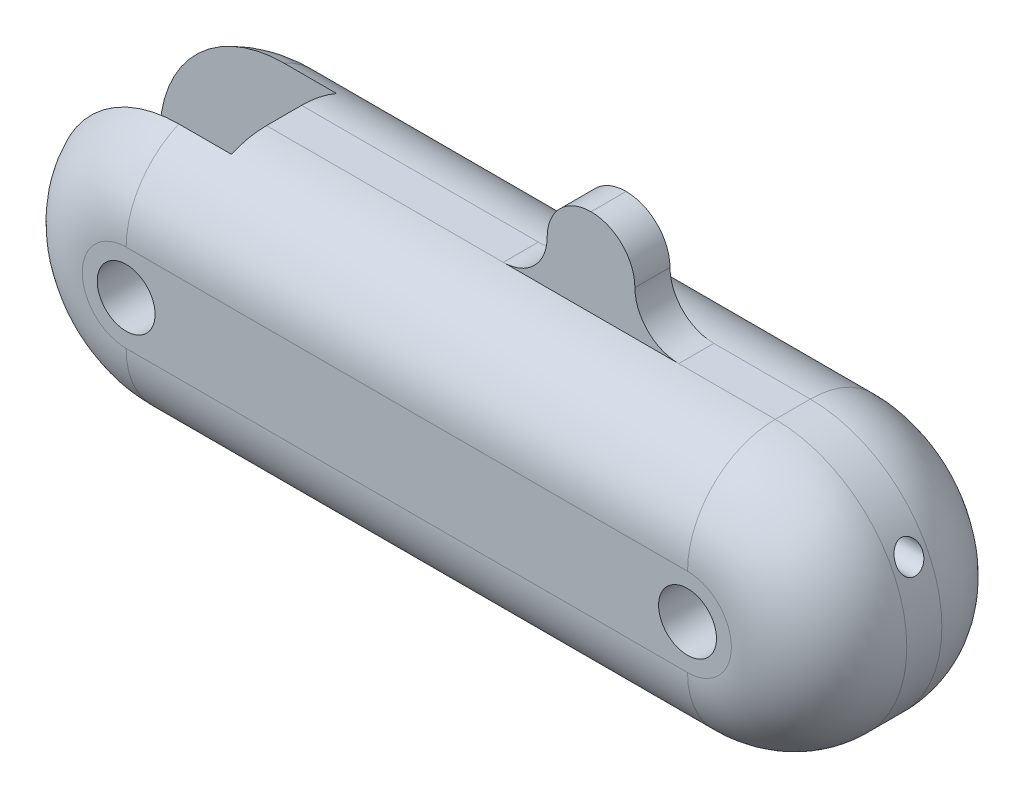
ISO-10303-21;
HEADER;
FILE_DESCRIPTION(('STEP AP214'),'2;1');
FILE_NAME('part.step','',(''),(''),'','','');
FILE_SCHEMA(('AUTOMOTIVE_DESIGN { 1 0 10303 214 1 1 1 1 }'));
ENDSEC;
DATA;
#1=APPLICATION_CONTEXT('core data for automotive mechanical design processes');
#2=APPLICATION_PROTOCOL_DEFINITION('international standard','automotive_design',2000,#1);
#3=PRODUCT_CONTEXT('',#1,'mechanical');
#4=PRODUCT('Part','Part','',(#3));
#5=PRODUCT_RELATED_PRODUCT_CATEGORY('part','',(#4));
#6=PRODUCT_DEFINITION_FORMATION('','',#4);
#7=PRODUCT_DEFINITION_CONTEXT('part definition',#1,'design');
#8=PRODUCT_DEFINITION('design','',#6,#7);
#9=PRODUCT_DEFINITION_SHAPE('','',#8);
#10=(LENGTH_UNIT() NAMED_UNIT(*) SI_UNIT(.MILLI.,.METRE.));
#11=(NAMED_UNIT(*) PLANE_ANGLE_UNIT() SI_UNIT($,.RADIAN.));
#12=(NAMED_UNIT(*) SI_UNIT($,.STERADIAN.) SOLID_ANGLE_UNIT());
#13=UNCERTAINTY_MEASURE_WITH_UNIT(LENGTH_MEASURE(1.E-05),#10,'distance_accuracy_value','');
#14=(GEOMETRIC_REPRESENTATION_CONTEXT(3) GLOBAL_UNCERTAINTY_ASSIGNED_CONTEXT((#13)) GLOBAL_UNIT_ASSIGNED_CONTEXT((#10,
#11,#12)) REPRESENTATION_CONTEXT('',''));
#15=CARTESIAN_POINT('',(0.,0.,0.));
#16=DIRECTION('',(0.,0.,1.));
#17=DIRECTION('',(1.,0.,0.));
#18=AXIS2_PLACEMENT_3D('',#15,#16,#17);
#19=CARTESIAN_POINT('',(-16.,0.,12.));
#20=DIRECTION('',(0.,-1.,0.));
#21=DIRECTION('',(1.,0.,0.));
#22=AXIS2_PLACEMENT_3D('',#19,#20,#21);
#23=PLANE('',#22);
#24=DIRECTION('',(-1.,0.,0.));
#25=VECTOR('',#24,1.);
#26=CARTESIAN_POINT('',(-16.,0.,7.));
#27=LINE('',#26,#25);
#28=CARTESIAN_POINT('',(-13.,0.,7.));
#29=VERTEX_POINT('',#28);
#30=CARTESIAN_POINT('',(0.5,0.,7.));
#31=VERTEX_POINT('',#30);
#32=EDGE_CURVE('E401',#29,#31,#27,.F.);
#33=ORIENTED_EDGE('',*,*,#32,.T.);
#34=DIRECTION('',(0.,0.,1.));
#35=VECTOR('',#34,1.);
#36=CARTESIAN_POINT('',(0.5,0.,5.));
#37=LINE('',#36,#35);
#38=CARTESIAN_POINT('',(0.5,0.,5.));
#39=VERTEX_POINT('',#38);
#40=EDGE_CURVE('E303',#31,#39,#37,.F.);
#41=ORIENTED_EDGE('',*,*,#40,.T.);
#42=DIRECTION('',(-1.,0.,0.));
#43=VECTOR('',#42,1.);
#44=CARTESIAN_POINT('',(-16.,0.,5.));
#45=LINE('',#44,#43);
#46=CARTESIAN_POINT('',(-13.,0.,5.));
#47=VERTEX_POINT('',#46);
#48=EDGE_CURVE('E403',#39,#47,#45,.T.);
#49=ORIENTED_EDGE('',*,*,#48,.T.);
#50=DIRECTION('',(0.,0.,1.));
#51=VECTOR('',#50,1.);
#52=CARTESIAN_POINT('',(-13.,0.,3.));
#53=LINE('',#52,#51);
#54=EDGE_CURVE('E335',#47,#29,#53,.T.);
#55=ORIENTED_EDGE('',*,*,#54,.T.);
#56=EDGE_LOOP('',(#33,#41,#49,#55));
#57=FACE_BOUND('',#56,.T.);
#58=ADVANCED_FACE('F33',(#57),#23,.F.);
#59=CARTESIAN_POINT('',(16.,0.,5.));
#60=VERTEX_POINT('',#59);
#61=CARTESIAN_POINT('',(10.5,0.,5.));
#62=VERTEX_POINT('',#61);
#63=EDGE_CURVE('E404',#60,#62,#45,.T.);
#64=ORIENTED_EDGE('',*,*,#63,.T.);
#65=DIRECTION('',(0.,0.,-1.));
#66=VECTOR('',#65,1.);
#67=CARTESIAN_POINT('',(10.5,0.,7.));
#68=LINE('',#67,#66);
#69=CARTESIAN_POINT('',(10.5,0.,7.));
#70=VERTEX_POINT('',#69);
#71=EDGE_CURVE('E310',#62,#70,#68,.F.);
#72=ORIENTED_EDGE('',*,*,#71,.T.);
#73=CARTESIAN_POINT('',(16.,0.,7.));
#74=VERTEX_POINT('',#73);
#75=EDGE_CURVE('E400',#70,#74,#27,.F.);
#76=ORIENTED_EDGE('',*,*,#75,.T.);
#77=DIRECTION('',(0.,0.,-1.));
#78=VECTOR('',#77,1.);
#79=CARTESIAN_POINT('',(16.,0.,12.));
#80=LINE('',#79,#78);
#81=EDGE_CURVE('E365',#74,#60,#80,.T.);
#82=ORIENTED_EDGE('',*,*,#81,.T.);
#83=EDGE_LOOP('',(#64,#72,#76,#82));
#84=FACE_BOUND('',#83,.T.);
#85=ADVANCED_FACE('F252',(#84),#23,.F.);
#86=CARTESIAN_POINT('',(16.,-7.5,12.));
#87=DIRECTION('',(0.,0.,-1.));
#88=DIRECTION('',(-1.,0.,0.));
#89=AXIS2_PLACEMENT_3D('',#86,#87,#88);
#90=CYLINDRICAL_SURFACE('',#89,7.50000000000001);
#91=CARTESIAN_POINT('',(22.6332495807108,-4.,5.25));
#92=CARTESIAN_POINT('',(22.6568652100945,-4.04475712896393,5.25000069696609));
#93=CARTESIAN_POINT('',(22.6800293767484,-4.08976492895581,5.25400927517588));
#94=CARTESIAN_POINT('',(22.7248658777341,-4.1790551435472,5.27027538348579));
#95=CARTESIAN_POINT('',(22.7465380552073,-4.22333748150426,5.28253377946583));
#96=CARTESIAN_POINT('',(22.7879116758938,-4.30992682615475,5.31545723063562));
#97=CARTESIAN_POINT('',(22.8076045419242,-4.35222484491178,5.336157060362));
#98=CARTESIAN_POINT('',(22.8443674457023,-4.43298144567067,5.38577757165474));
#99=CARTESIAN_POINT('',(22.8614387598698,-4.47144189295035,5.41469423281491));
#100=CARTESIAN_POINT('',(22.8911623275913,-4.53973742839442,5.47736494318931));
#101=CARTESIAN_POINT('',(22.9040660292328,-4.57002664644257,5.51050419857445));
#102=CARTESIAN_POINT('',(22.9269531189977,-4.62455266895225,5.58231320481981));
#103=CARTESIAN_POINT('',(22.9369382953721,-4.64879317826637,5.62097954737949));
#104=CARTESIAN_POINT('',(22.9529869063967,-4.68817040363519,5.69891372918083));
#105=CARTESIAN_POINT('',(22.9593235719089,-4.70393268754241,5.73781010676271));
#106=CARTESIAN_POINT('',(22.9692604124838,-4.72879255774519,5.81800707831997));
#107=CARTESIAN_POINT('',(22.9728616243726,-4.73789266917448,5.85930675496975));
#108=CARTESIAN_POINT('',(22.9771383733366,-4.74871452689673,5.94068250069714));
#109=CARTESIAN_POINT('',(22.977964010453,-4.75081476114192,5.98070082955286));
#110=CARTESIAN_POINT('',(22.9770983322195,-4.7486184483497,6.06053083904639));
#111=CARTESIAN_POINT('',(22.9754073999443,-4.74432287488856,6.10034255021011));
#112=CARTESIAN_POINT('',(22.9695866751644,-4.72963511410702,6.17795271899596));
#113=CARTESIAN_POINT('',(22.9654973975342,-4.71934422356824,6.21577350399642));
#114=CARTESIAN_POINT('',(22.9549825205337,-4.69314838459035,6.28906769075068));
#115=CARTESIAN_POINT('',(22.9485568521372,-4.67724327028505,6.32454102311475));
#116=CARTESIAN_POINT('',(22.9333388667533,-4.6400662297977,6.39288228153309));
#117=CARTESIAN_POINT('',(22.9245047094671,-4.61869988546117,6.42568939411336));
#118=CARTESIAN_POINT('',(22.9046866646446,-4.57152680231289,6.48719637753227));
#119=CARTESIAN_POINT('',(22.8937023940896,-4.54571927245275,6.51589551500178));
#120=CARTESIAN_POINT('',(22.8691641560276,-4.48908949081757,6.57000258230612));
#121=CARTESIAN_POINT('',(22.8555068553954,-4.45807722125553,6.5951643464781));
#122=CARTESIAN_POINT('',(22.8263026183871,-4.39309447378724,6.63994971569263));
#123=CARTESIAN_POINT('',(22.8107550987679,-4.35912308374078,6.65957160512373));
#124=CARTESIAN_POINT('',(22.7767476900571,-4.28636850281494,6.69444106370555));
#125=CARTESIAN_POINT('',(22.7581540750848,-4.24741815677613,6.709208755228));
#126=CARTESIAN_POINT('',(22.71950375169,-4.16830211749591,6.73203260387971));
#127=CARTESIAN_POINT('',(22.6994464555126,-4.12813593985683,6.74008604853172));
#128=CARTESIAN_POINT('',(22.6563085373537,-4.04369983150149,6.75004397376913));
#129=CARTESIAN_POINT('',(22.6331223675881,-3.99940542782166,6.75128539519353));
#130=CARTESIAN_POINT('',(22.5860588230827,-3.91164199428551,6.74607476207137));
#131=CARTESIAN_POINT('',(22.5621811684306,-3.86817331081142,6.73961954823108));
#132=CARTESIAN_POINT('',(22.5124790173255,-3.77973344935155,6.71847576043198));
#133=CARTESIAN_POINT('',(22.486647679833,-3.73490877068938,6.70318531284591));
#134=CARTESIAN_POINT('',(22.4357343535149,-3.64852752977387,6.66423898345623));
#135=CARTESIAN_POINT('',(22.4106529100033,-3.60697331155975,6.64057716719651));
#136=CARTESIAN_POINT('',(22.3621650327383,-3.52822396654696,6.58503138384834));
#137=CARTESIAN_POINT('',(22.3387675581801,-3.49105156771565,6.55310707545874));
#138=CARTESIAN_POINT('',(22.2951208610375,-3.42285769464486,6.48149765334739));
#139=CARTESIAN_POINT('',(22.2748655342586,-3.39182426121488,6.44182793409188));
#140=CARTESIAN_POINT('',(22.2441296604099,-3.34531674164023,6.36773463912217));
#141=CARTESIAN_POINT('',(22.2325031742713,-3.32792254459539,6.33498389337065));
#142=CARTESIAN_POINT('',(22.2123269530317,-3.29793850852277,6.26646615448601));
#143=CARTESIAN_POINT('',(22.2037747168345,-3.28534476351841,6.23070164261998));
#144=CARTESIAN_POINT('',(22.1902984185428,-3.26557533684953,6.15681284743057));
#145=CARTESIAN_POINT('',(22.1853946024228,-3.2584298837293,6.1186766501743));
#146=CARTESIAN_POINT('',(22.1797033076017,-3.25014186597953,6.04145384644772));
#147=CARTESIAN_POINT('',(22.1789142561407,-3.2489970077805,6.00236760884516));
#148=CARTESIAN_POINT('',(22.1813931710046,-3.25260309406563,5.92827495646399));
#149=CARTESIAN_POINT('',(22.1842899276402,-3.25681456761362,5.8932277732572));
#150=CARTESIAN_POINT('',(22.193308211172,-3.26998861428829,5.82447604328706));
#151=CARTESIAN_POINT('',(22.1994299026123,-3.27895142984032,5.79077156512622));
#152=CARTESIAN_POINT('',(22.2146133796125,-3.30133780469566,5.72505739919943));
#153=CARTESIAN_POINT('',(22.2237143408386,-3.31482086291967,5.69307729890249));
#154=CARTESIAN_POINT('',(22.2443359325697,-3.3456514298456,5.63189268510944));
#155=CARTESIAN_POINT('',(22.255857406406,-3.36300028555895,5.60268914415963));
#156=CARTESIAN_POINT('',(22.2823887723703,-3.40338626249218,5.54395537476474));
#157=CARTESIAN_POINT('',(22.2976550846796,-3.42686421313565,5.51484516788648));
#158=CARTESIAN_POINT('',(22.3299678350555,-3.47726403649822,5.46091603715502));
#159=CARTESIAN_POINT('',(22.3470153888876,-3.50418807023977,5.43609982921319));
#160=CARTESIAN_POINT('',(22.3852466837685,-3.56551988782083,5.38721317350811));
#161=CARTESIAN_POINT('',(22.4066486852218,-3.60042939812047,5.3639419420298));
#162=CARTESIAN_POINT('',(22.4503628456514,-3.67317076129835,5.32367729284259));
#163=CARTESIAN_POINT('',(22.4726753450833,-3.71100371213012,5.30668624776824));
#164=CARTESIAN_POINT('',(22.5182375061319,-3.78991735324902,5.27877439425189));
#165=CARTESIAN_POINT('',(22.5414956207365,-3.83106029081337,5.26804311416663));
#166=CARTESIAN_POINT('',(22.5877229967265,-3.91472586515507,5.25365538695503));
#167=CARTESIAN_POINT('',(22.6106922419369,-3.95724857871951,5.24999933426715));
#168=CARTESIAN_POINT('',(22.6332495807108,-4.,5.25));
#169=B_SPLINE_CURVE_WITH_KNOTS('',3,(#91,#92,#93,#94,#95,#96,#97,#98,#99,#100,#101,#102,#103,
#104,#105,#106,#107,#108,#109,#110,#111,#112,#113,#114,#115,#116,#117,#118,#119,#120,#121,#122,
#123,#124,#125,#126,#127,#128,#129,#130,#131,#132,#133,#134,#135,#136,#137,#138,#139,#140,#141,
#142,#143,#144,#145,#146,#147,#148,#149,#150,#151,#152,#153,#154,#155,#156,#157,#158,#159,#160,
#161,#162,#163,#164,#165,#166,#167,#168),.UNSPECIFIED.,.T.,.F.,(4,2,2,2,2,2,2,2,2,2,2,2,2,2,2,2,
2,2,2,2,2,2,2,2,2,2,2,2,2,2,2,2,2,2,2,2,2,2,4),(0.,0.151661005421156,0.303337931279042,
0.455646106620897,0.607879887173714,0.747256765609736,0.886548064567123,1.01322728571309,
1.1398584673014,1.25952084912074,1.37916501767401,1.49684401087809,1.61452648107235,
1.73440026024665,1.85429541305983,1.98037574012025,2.1064950695399,2.24277688192367,
2.37911372392491,2.52851299639748,2.6779736149916,2.83907034561562,3.00028150715966,
3.1622951331674,3.32398996653117,3.44011001590393,3.55613537933343,3.67279988942346,
3.78941980432111,3.89517224873057,4.00093008941374,4.10813854282546,4.21538441088787,
4.33610582335719,4.45690331400403,4.59763975196048,4.73842930548272,4.88328582896064,
5.02815042784517),.UNSPECIFIED.);
#170=CARTESIAN_POINT('',(22.6332495807108,-4.,5.25));
#171=VERTEX_POINT('',#170);
#172=EDGE_CURVE('E181',#171,#171,#169,.T.);
#173=ORIENTED_EDGE('',*,*,#172,.T.);
#174=EDGE_LOOP('',(#173));
#175=FACE_BOUND('',#174,.T.);
#176=DIRECTION('',(0.,0.,-1.));
#177=VECTOR('',#176,1.);
#178=CARTESIAN_POINT('',(16.,-15.,12.));
#179=LINE('',#178,#177);
#180=CARTESIAN_POINT('',(16.,-15.,7.));
#181=VERTEX_POINT('',#180);
#182=CARTESIAN_POINT('',(16.,-15.,5.));
#183=VERTEX_POINT('',#182);
#184=EDGE_CURVE('E362',#181,#183,#179,.T.);
#185=ORIENTED_EDGE('',*,*,#184,.T.);
#186=CARTESIAN_POINT('',(16.,-7.5,5.));
#187=DIRECTION('',(0.,0.,-1.));
#188=DIRECTION('',(-1.,0.,0.));
#189=AXIS2_PLACEMENT_3D('',#186,#187,#188);
#190=CIRCLE('',#189,7.50000000000001);
#191=EDGE_CURVE('E372',#183,#60,#190,.F.);
#192=ORIENTED_EDGE('',*,*,#191,.T.);
#193=ORIENTED_EDGE('',*,*,#81,.F.);
#194=CARTESIAN_POINT('',(16.,-7.5,7.));
#195=DIRECTION('',(0.,0.,-1.));
#196=DIRECTION('',(-1.,0.,0.));
#197=AXIS2_PLACEMENT_3D('',#194,#195,#196);
#198=CIRCLE('',#197,7.50000000000001);
#199=EDGE_CURVE('E369',#74,#181,#198,.T.);
#200=ORIENTED_EDGE('',*,*,#199,.T.);
#201=EDGE_LOOP('',(#185,#192,#193,#200));
#202=FACE_BOUND('',#201,.T.);
#203=ADVANCED_FACE('F257',(#175,#202),#90,.T.);
#204=CARTESIAN_POINT('',(-16.,-15.,12.));
#205=DIRECTION('',(0.,1.,0.));
#206=DIRECTION('',(-1.,0.,0.));
#207=AXIS2_PLACEMENT_3D('',#204,#205,#206);
#208=PLANE('',#207);
#209=DIRECTION('',(0.,0.,1.));
#210=VECTOR('',#209,1.);
#211=CARTESIAN_POINT('',(10.,-15.,12.));
#212=LINE('',#211,#210);
#213=CARTESIAN_POINT('',(10.,-15.,5.25));
#214=VERTEX_POINT('',#213);
#215=CARTESIAN_POINT('',(10.,-15.,6.75));
#216=VERTEX_POINT('',#215);
#217=EDGE_CURVE('E11',#214,#216,#212,.T.);
#218=ORIENTED_EDGE('',*,*,#217,.F.);
#219=CARTESIAN_POINT('',(10.,-15.,5.25));
#220=CARTESIAN_POINT('',(9.8786553115528,-15.0000000000001,5.25000690439239));
#221=CARTESIAN_POINT('',(9.7573099278768,-15.,5.250891047548));
#222=CARTESIAN_POINT('',(9.51464002609246,-15.,5.25446249443581));
#223=CARTESIAN_POINT('',(9.39331550925674,-14.9999999999999,5.25714988424491));
#224=CARTESIAN_POINT('',(9.15072021487093,-15.0000000000001,5.26437654510316));
#225=CARTESIAN_POINT('',(9.02944943775978,-15.0000000000003,5.26891583100906));
#226=CARTESIAN_POINT('',(8.7869985606308,-14.9999999999997,5.27994967343772));
#227=CARTESIAN_POINT('',(8.66581845887886,-14.999999999999,5.2864441915576));
#228=CARTESIAN_POINT('',(8.42357835076428,-14.999999999999,5.30154667188666));
#229=CARTESIAN_POINT('',(8.30251835576131,-14.9999999999997,5.31015481782885));
#230=CARTESIAN_POINT('',(8.06058890785677,-15.0000000000003,5.32972024380476));
#231=CARTESIAN_POINT('',(7.93971945096956,-15.0000000000001,5.34067747402587));
#232=CARTESIAN_POINT('',(7.6982207222834,-14.9999999999999,5.36529893233107));
#233=CARTESIAN_POINT('',(7.57759152436799,-15.,5.37896389247002));
#234=CARTESIAN_POINT('',(7.33675197460111,-15.,5.40953828680783));
#235=CARTESIAN_POINT('',(7.21654157313851,-15.,5.42644732241352));
#236=CARTESIAN_POINT('',(7.00146325352219,-15.,5.46050536397854));
#237=CARTESIAN_POINT('',(6.90647524844132,-15.,5.47688761783767));
#238=CARTESIAN_POINT('',(6.71710121712892,-15.,5.51304063760114));
#239=CARTESIAN_POINT('',(6.62271541284863,-15.0000000000001,5.53281258557124));
#240=CARTESIAN_POINT('',(6.44730199727983,-15.,5.57417603428693));
#241=CARTESIAN_POINT('',(6.36614305064421,-14.9999999999999,5.59519058592666));
#242=CARTESIAN_POINT('',(6.24558282318529,-15.0000000000001,5.63074022663307));
#243=CARTESIAN_POINT('',(6.20559275732403,-15.0000000000002,5.64326129427213));
#244=CARTESIAN_POINT('',(6.12622251344239,-14.9999999999998,5.67006693352249));
#245=CARTESIAN_POINT('',(6.08684207960103,-14.9999999999992,5.68435074154142));
#246=CARTESIAN_POINT('',(6.00889388978743,-14.9999999999992,5.71537872090576));
#247=CARTESIAN_POINT('',(5.97032879303098,-14.9999999999997,5.73212984146628));
#248=CARTESIAN_POINT('',(5.91381385421703,-15.0000000000002,5.76003173980566));
#249=CARTESIAN_POINT('',(5.89518708672045,-15.0000000000003,5.76980147903886));
#250=CARTESIAN_POINT('',(5.85862054052747,-14.9999999999997,5.79054110812943));
#251=CARTESIAN_POINT('',(5.84068028058815,-14.999999999999,5.80151013567805));
#252=CARTESIAN_POINT('',(5.80572364230906,-14.999999999999,5.82516138606118));
#253=CARTESIAN_POINT('',(5.7887160580541,-14.9999999999998,5.83785693458191));
#254=CARTESIAN_POINT('',(5.75668423800148,-15.0000000000002,5.86545088792904));
#255=CARTESIAN_POINT('',(5.74164907203042,-14.9999999999999,5.88033609057445));
#256=CARTESIAN_POINT('',(5.71713471374322,-14.9999999999998,5.91107943078985));
#257=CARTESIAN_POINT('',(5.7071741931091,-15.,5.92651642502982));
#258=CARTESIAN_POINT('',(5.69620980665463,-15.,5.95161194383834));
#259=CARTESIAN_POINT('',(5.69321034268142,-15.,5.96037681795978));
#260=CARTESIAN_POINT('',(5.68899511081927,-15.,5.97832228811796));
#261=CARTESIAN_POINT('',(5.68777498882952,-15.,5.98750181249339));
#262=CARTESIAN_POINT('',(5.68733704480131,-15.,6.00477258037728));
#263=CARTESIAN_POINT('',(5.68789102202117,-15.,6.01285854575509));
#264=CARTESIAN_POINT('',(5.69043642320495,-15.,6.0288034760167));
#265=CARTESIAN_POINT('',(5.69242958991749,-15.,6.03666215366162));
#266=CARTESIAN_POINT('',(5.70155511505826,-15.,6.06347104019545));
#267=CARTESIAN_POINT('',(5.71190682126472,-15.,6.08130568452829));
#268=CARTESIAN_POINT('',(5.73500478329441,-15.,6.11199334886427));
#269=CARTESIAN_POINT('',(5.74736858443041,-15.,6.12517710821214));
#270=CARTESIAN_POINT('',(5.77379212369221,-15.,6.14979852584465));
#271=CARTESIAN_POINT('',(5.78785767324653,-15.,6.16122988030437));
#272=CARTESIAN_POINT('',(5.82564461741108,-15.0000000000001,6.18914411903249));
#273=CARTESIAN_POINT('',(5.85012249214401,-15.0000000000003,6.20457458874058));
#274=CARTESIAN_POINT('',(5.90037226714866,-14.9999999999997,6.23319904428693));
#275=CARTESIAN_POINT('',(5.92614694758817,-14.9999999999989,6.24638793446797));
#276=CARTESIAN_POINT('',(5.97854573968428,-15.0000000000011,6.27117870211012));
#277=CARTESIAN_POINT('',(6.00517240224077,-15.0000000000041,6.28277512852481));
#278=CARTESIAN_POINT('',(6.05893079478433,-14.9999999999959,6.30473615961403));
#279=CARTESIAN_POINT('',(6.08606267389185,-14.9999999999847,6.31510039370694));
#280=CARTESIAN_POINT('',(6.14455040902431,-14.9999999999828,6.33625754556623));
#281=CARTESIAN_POINT('',(6.17595940836225,-14.9999999999953,6.34690265970325));
#282=CARTESIAN_POINT('',(6.23910705570479,-15.0000000000047,6.36718794454289));
#283=CARTESIAN_POINT('',(6.27084579908401,-15.0000000000016,6.37682781505946));
#284=CARTESIAN_POINT('',(6.36618816425292,-14.9999999999967,6.40445082314261));
#285=CARTESIAN_POINT('',(6.43014441330145,-14.9999999999991,6.42121578269355));
#286=CARTESIAN_POINT('',(6.55864342010346,-15.0000000000009,6.45240136595964));
#287=CARTESIAN_POINT('',(6.62318643844035,-15.0000000000002,6.46682088838189));
#288=CARTESIAN_POINT('',(6.7526622638638,-14.9999999999998,6.49382232045113));
#289=CARTESIAN_POINT('',(6.81759512576085,-14.9999999999999,6.50640396508723));
#290=CARTESIAN_POINT('',(7.01297711551439,-15.0000000000002,6.54196041585399));
#291=CARTESIAN_POINT('',(7.14383100263404,-15.,6.56270575231078));
#292=CARTESIAN_POINT('',(7.40589118000774,-15.,6.59984925588892));
#293=CARTESIAN_POINT('',(7.53709640241337,-15.,6.61625523018717));
#294=CARTESIAN_POINT('',(7.79981759677297,-15.,6.64561848044803));
#295=CARTESIAN_POINT('',(7.9313333650194,-15.,6.65857759602564));
#296=CARTESIAN_POINT('',(8.1946094651167,-15.,6.68159485059648));
#297=CARTESIAN_POINT('',(8.32636978658885,-15.,6.69165310999021));
#298=CARTESIAN_POINT('',(8.59007585392896,-15.,6.70920881756569));
#299=CARTESIAN_POINT('',(8.72202162195315,-15.,6.71670592795358));
#300=CARTESIAN_POINT('',(9.04481618190237,-15.,6.73218255788444));
#301=CARTESIAN_POINT('',(9.23572719646818,-15.,6.73888990749663));
#302=CARTESIAN_POINT('',(9.52222208680566,-15.,6.74557060760416));
#303=CARTESIAN_POINT('',(9.61777083412083,-15.,6.74723411152844));
#304=CARTESIAN_POINT('',(9.80887932228001,-15.,6.74944799045482));
#305=CARTESIAN_POINT('',(9.90443906286278,-15.,6.74999838795598));
#306=CARTESIAN_POINT('',(9.99999999999999,-15.,6.75));
#307=B_SPLINE_CURVE_WITH_KNOTS('',3,(#219,#220,#221,#222,#223,#224,#225,#226,#227,#228,#229,
#230,#231,#232,#233,#234,#235,#236,#237,#238,#239,#240,#241,#242,#243,#244,#245,#246,#247,#248,
#249,#250,#251,#252,#253,#254,#255,#256,#257,#258,#259,#260,#261,#262,#263,#264,#265,#266,#267,
#268,#269,#270,#271,#272,#273,#274,#275,#276,#277,#278,#279,#280,#281,#282,#283,#284,#285,#286,
#287,#288,#289,#290,#291,#292,#293,#294,#295,#296,#297,#298,#299,#300,#301,#302,#303,#304,#305,
#306),.UNSPECIFIED.,.F.,.F.,(4,2,2,2,2,2,2,2,2,2,2,2,2,2,2,2,2,2,2,2,2,2,2,2,2,2,2,2,2,2,2,2,2,
2,2,2,2,2,2,2,2,2,2,4),(0.,0.364031968082436,0.728081314249738,1.09213358104363,
1.45617869792269,1.82025547165356,2.18432452585767,2.54849214345588,2.91261504511522,
3.20174043444684,3.49096685443027,3.74233431842156,3.86801606503461,3.99364355808143,
4.11963189924161,4.18270036984509,4.24572378771076,4.30926461593009,4.37243694692401,
4.42684925262164,4.45449118406235,4.48206536074311,4.50624180427977,4.53044757284627,
4.59109885006721,4.64515923221705,4.69940973631592,4.78600951823951,4.87280360328479,
4.95988775124416,5.04699802384502,5.14646729098387,5.24596617710415,5.44424587499086,
5.64261840741442,5.8410195157845,6.23837099262914,6.63500263414805,7.03142216360787,
7.42782523724423,7.82428057292375,8.39730108679521,8.68398563760007,8.97066439363672),.UNSPECIFIED.);
#308=EDGE_CURVE('E173',#214,#216,#307,.T.);
#309=ORIENTED_EDGE('',*,*,#308,.T.);
#310=EDGE_LOOP('',(#218,#309));
#311=FACE_BOUND('',#310,.T.);
#312=DIRECTION('',(1.,0.,0.));
#313=VECTOR('',#312,1.);
#314=CARTESIAN_POINT('',(-16.,-15.,7.));
#315=LINE('',#314,#313);
#316=CARTESIAN_POINT('',(-13.,-15.,7.));
#317=VERTEX_POINT('',#316);
#318=EDGE_CURVE('E385',#181,#317,#315,.F.);
#319=ORIENTED_EDGE('',*,*,#318,.T.);
#320=DIRECTION('',(0.,0.,-1.));
#321=VECTOR('',#320,1.);
#322=CARTESIAN_POINT('',(-13.,-15.,12.));
#323=LINE('',#322,#321);
#324=CARTESIAN_POINT('',(-13.,-15.,5.));
#325=VERTEX_POINT('',#324);
#326=EDGE_CURVE('E350',#317,#325,#323,.T.);
#327=ORIENTED_EDGE('',*,*,#326,.T.);
#328=DIRECTION('',(1.,0.,0.));
#329=VECTOR('',#328,1.);
#330=CARTESIAN_POINT('',(16.,-15.,5.));
#331=LINE('',#330,#329);
#332=EDGE_CURVE('E388',#325,#183,#331,.T.);
#333=ORIENTED_EDGE('',*,*,#332,.T.);
#334=ORIENTED_EDGE('',*,*,#184,.F.);
#335=EDGE_LOOP('',(#319,#327,#333,#334));
#336=FACE_BOUND('',#335,.T.);
#337=ADVANCED_FACE('F176',(#311,#336),#208,.F.);
#338=CARTESIAN_POINT('',(16.,-7.5,12.));
#339=DIRECTION('',(0.,0.,-1.));
#340=DIRECTION('',(-1.,0.,0.));
#341=AXIS2_PLACEMENT_3D('',#338,#339,#340);
#342=PLANE('',#341);
#343=CARTESIAN_POINT('',(16.,-7.50000000000001,12.));
#344=DIRECTION('',(0.,0.,1.));
#345=DIRECTION('',(1.,0.,0.));
#346=AXIS2_PLACEMENT_3D('',#343,#344,#345);
#347=CIRCLE('',#346,1.65);
#348=CARTESIAN_POINT('',(17.65,-7.50000000000001,12.));
#349=VERTEX_POINT('',#348);
#350=EDGE_CURVE('E331',#349,#349,#347,.T.);
#351=ORIENTED_EDGE('',*,*,#350,.F.);
#352=EDGE_LOOP('',(#351));
#353=FACE_BOUND('',#352,.T.);
#354=CARTESIAN_POINT('',(-16.,-7.50000000000001,12.));
#355=DIRECTION('',(0.,0.,1.));
#356=DIRECTION('',(1.,0.,0.));
#357=AXIS2_PLACEMENT_3D('',#354,#355,#356);
#358=CIRCLE('',#357,1.65);
#359=CARTESIAN_POINT('',(-14.35,-7.50000000000001,12.));
#360=VERTEX_POINT('',#359);
#361=EDGE_CURVE('E324',#360,#360,#358,.T.);
#362=ORIENTED_EDGE('',*,*,#361,.F.);
#363=EDGE_LOOP('',(#362));
#364=FACE_BOUND('',#363,.T.);
#365=DIRECTION('',(1.,0.,0.));
#366=VECTOR('',#365,1.);
#367=CARTESIAN_POINT('',(16.,-10.,12.));
#368=LINE('',#367,#366);
#369=CARTESIAN_POINT('',(-16.,-10.,12.));
#370=VERTEX_POINT('',#369);
#371=CARTESIAN_POINT('',(16.,-10.,12.));
#372=VERTEX_POINT('',#371);
#373=EDGE_CURVE('E395',#370,#372,#368,.T.);
#374=ORIENTED_EDGE('',*,*,#373,.T.);
#375=CARTESIAN_POINT('',(16.,-7.5,12.));
#376=DIRECTION('',(0.,0.,-1.));
#377=DIRECTION('',(-1.,0.,0.));
#378=AXIS2_PLACEMENT_3D('',#375,#376,#377);
#379=CIRCLE('',#378,2.5);
#380=CARTESIAN_POINT('',(16.,-4.99999999999999,12.));
#381=VERTEX_POINT('',#380);
#382=EDGE_CURVE('E397',#372,#381,#379,.F.);
#383=ORIENTED_EDGE('',*,*,#382,.T.);
#384=DIRECTION('',(-1.,0.,0.));
#385=VECTOR('',#384,1.);
#386=CARTESIAN_POINT('',(16.,-4.99999999999999,12.));
#387=LINE('',#386,#385);
#388=CARTESIAN_POINT('',(-16.,-5.,12.));
#389=VERTEX_POINT('',#388);
#390=EDGE_CURVE('E390',#381,#389,#387,.T.);
#391=ORIENTED_EDGE('',*,*,#390,.T.);
#392=CARTESIAN_POINT('',(-16.,-7.5,12.));
#393=DIRECTION('',(0.,0.,-1.));
#394=DIRECTION('',(-1.,0.,0.));
#395=AXIS2_PLACEMENT_3D('',#392,#393,#394);
#396=CIRCLE('',#395,2.5);
#397=EDGE_CURVE('E393',#389,#370,#396,.F.);
#398=ORIENTED_EDGE('',*,*,#397,.T.);
#399=EDGE_LOOP('',(#374,#383,#391,#398));
#400=FACE_BOUND('',#399,.T.);
#401=ADVANCED_FACE('F236',(#353,#364,#400),#342,.F.);
#402=CARTESIAN_POINT('',(16.,-7.5,0.));
#403=DIRECTION('',(0.,0.,-1.));
#404=DIRECTION('',(-1.,0.,0.));
#405=AXIS2_PLACEMENT_3D('',#402,#403,#404);
#406=PLANE('',#405);
#407=CARTESIAN_POINT('',(16.,-7.50000000000001,0.));
#408=DIRECTION('',(0.,0.,1.));
#409=DIRECTION('',(1.,0.,0.));
#410=AXIS2_PLACEMENT_3D('',#407,#408,#409);
#411=CIRCLE('',#410,1.65);
#412=CARTESIAN_POINT('',(17.65,-7.50000000000001,0.));
#413=VERTEX_POINT('',#412);
#414=EDGE_CURVE('E328',#413,#413,#411,.T.);
#415=ORIENTED_EDGE('',*,*,#414,.T.);
#416=EDGE_LOOP('',(#415));
#417=FACE_BOUND('',#416,.T.);
#418=CARTESIAN_POINT('',(-16.,-7.50000000000001,0.));
#419=DIRECTION('',(0.,0.,1.));
#420=DIRECTION('',(1.,0.,0.));
#421=AXIS2_PLACEMENT_3D('',#418,#419,#420);
#422=CIRCLE('',#421,1.65);
#423=CARTESIAN_POINT('',(-14.35,-7.50000000000001,0.));
#424=VERTEX_POINT('',#423);
#425=EDGE_CURVE('E318',#424,#424,#422,.T.);
#426=ORIENTED_EDGE('',*,*,#425,.T.);
#427=EDGE_LOOP('',(#426));
#428=FACE_BOUND('',#427,.T.);
#429=DIRECTION('',(-1.,0.,0.));
#430=VECTOR('',#429,1.);
#431=CARTESIAN_POINT('',(16.,-4.99999999999999,0.));
#432=LINE('',#431,#430);
#433=CARTESIAN_POINT('',(-16.,-5.,0.));
#434=VERTEX_POINT('',#433);
#435=CARTESIAN_POINT('',(16.,-4.99999999999999,0.));
#436=VERTEX_POINT('',#435);
#437=EDGE_CURVE('E375',#434,#436,#432,.F.);
#438=ORIENTED_EDGE('',*,*,#437,.T.);
#439=CARTESIAN_POINT('',(16.,-7.5,0.));
#440=DIRECTION('',(0.,0.,-1.));
#441=DIRECTION('',(-1.,0.,0.));
#442=AXIS2_PLACEMENT_3D('',#439,#440,#441);
#443=CIRCLE('',#442,2.5);
#444=CARTESIAN_POINT('',(16.,-10.,0.));
#445=VERTEX_POINT('',#444);
#446=EDGE_CURVE('E382',#436,#445,#443,.T.);
#447=ORIENTED_EDGE('',*,*,#446,.T.);
#448=DIRECTION('',(1.,0.,0.));
#449=VECTOR('',#448,1.);
#450=CARTESIAN_POINT('',(-16.,-10.,0.));
#451=LINE('',#450,#449);
#452=CARTESIAN_POINT('',(-16.,-10.,0.));
#453=VERTEX_POINT('',#452);
#454=EDGE_CURVE('E379',#445,#453,#451,.F.);
#455=ORIENTED_EDGE('',*,*,#454,.T.);
#456=CARTESIAN_POINT('',(-16.,-7.5,0.));
#457=DIRECTION('',(0.,0.,-1.));
#458=DIRECTION('',(-1.,0.,0.));
#459=AXIS2_PLACEMENT_3D('',#456,#457,#458);
#460=CIRCLE('',#459,2.5);
#461=EDGE_CURVE('E377',#453,#434,#460,.T.);
#462=ORIENTED_EDGE('',*,*,#461,.T.);
#463=EDGE_LOOP('',(#438,#447,#455,#462));
#464=FACE_BOUND('',#463,.T.);
#465=ADVANCED_FACE('F238',(#417,#428,#464),#406,.T.);
#466=CARTESIAN_POINT('',(-16.,-7.5,5.));
#467=DIRECTION('',(0.,0.,-1.));
#468=DIRECTION('',(-1.,0.,0.));
#469=AXIS2_PLACEMENT_3D('',#466,#467,#468);
#470=DEGENERATE_TOROIDAL_SURFACE('',#469,2.5,5.,.T.);
#471=CARTESIAN_POINT('',(-16.,-7.5,3.));
#472=DIRECTION('',(0.,0.,-1.));
#473=DIRECTION('',(-1.,0.,0.));
#474=AXIS2_PLACEMENT_3D('',#471,#472,#473);
#475=CIRCLE('',#474,7.08257569495584);
#476=CARTESIAN_POINT('',(-16.,-0.417424305044161,3.));
#477=VERTEX_POINT('',#476);
#478=CARTESIAN_POINT('',(-16.,-14.5825756949558,3.));
#479=VERTEX_POINT('',#478);
#480=EDGE_CURVE('E357',#477,#479,#475,.F.);
#481=ORIENTED_EDGE('',*,*,#480,.F.);
#482=CARTESIAN_POINT('',(-16.,-5.,5.));
#483=DIRECTION('',(1.,0.,0.));
#484=DIRECTION('',(0.,1.,0.));
#485=AXIS2_PLACEMENT_3D('',#482,#483,#484);
#486=CIRCLE('',#485,5.);
#487=EDGE_CURVE('E412',#434,#477,#486,.T.);
#488=ORIENTED_EDGE('',*,*,#487,.F.);
#489=ORIENTED_EDGE('',*,*,#461,.F.);
#490=CARTESIAN_POINT('',(-16.,-10.,5.));
#491=DIRECTION('',(1.,0.,0.));
#492=DIRECTION('',(0.,0.,-1.));
#493=AXIS2_PLACEMENT_3D('',#490,#491,#492);
#494=CIRCLE('',#493,5.);
#495=EDGE_CURVE('E366',#479,#453,#494,.T.);
#496=ORIENTED_EDGE('',*,*,#495,.F.);
#497=EDGE_LOOP('',(#481,#488,#489,#496));
#498=FACE_BOUND('',#497,.T.);
#499=ADVANCED_FACE('F241',(#498),#470,.T.);
#500=CARTESIAN_POINT('',(-16.,-10.,5.));
#501=DIRECTION('',(-1.,0.,0.));
#502=DIRECTION('',(0.,-1.,0.));
#503=AXIS2_PLACEMENT_3D('',#500,#501,#502);
#504=CYLINDRICAL_SURFACE('',#503,5.);
#505=CARTESIAN_POINT('',(-13.,-10.,5.));
#506=DIRECTION('',(1.,0.,0.));
#507=DIRECTION('',(0.,0.,-1.));
#508=AXIS2_PLACEMENT_3D('',#505,#506,#507);
#509=CIRCLE('',#508,5.);
#510=CARTESIAN_POINT('',(-13.,-14.5825756949558,3.));
#511=VERTEX_POINT('',#510);
#512=EDGE_CURVE('E353',#511,#325,#509,.F.);
#513=ORIENTED_EDGE('',*,*,#512,.F.);
#514=DIRECTION('',(-1.,0.,0.));
#515=VECTOR('',#514,1.);
#516=CARTESIAN_POINT('',(-16.,-14.5825756949558,3.));
#517=LINE('',#516,#515);
#518=EDGE_CURVE('E359',#479,#511,#517,.F.);
#519=ORIENTED_EDGE('',*,*,#518,.F.);
#520=ORIENTED_EDGE('',*,*,#495,.T.);
#521=ORIENTED_EDGE('',*,*,#454,.F.);
#522=CARTESIAN_POINT('',(16.,-10.,5.));
#523=DIRECTION('',(1.,0.,0.));
#524=DIRECTION('',(0.,0.,-1.));
#525=AXIS2_PLACEMENT_3D('',#522,#523,#524);
#526=CIRCLE('',#525,5.);
#527=EDGE_CURVE('E409',#183,#445,#526,.T.);
#528=ORIENTED_EDGE('',*,*,#527,.F.);
#529=ORIENTED_EDGE('',*,*,#332,.F.);
#530=EDGE_LOOP('',(#513,#519,#520,#521,#528,#529));
#531=FACE_BOUND('',#530,.T.);
#532=ADVANCED_FACE('F246',(#531),#504,.T.);
#533=CARTESIAN_POINT('',(-16.,-5.,5.));
#534=DIRECTION('',(1.,0.,0.));
#535=DIRECTION('',(0.,1.,0.));
#536=AXIS2_PLACEMENT_3D('',#533,#534,#535);
#537=CYLINDRICAL_SURFACE('',#536,5.);
#538=CARTESIAN_POINT('',(-13.,-5.,5.));
#539=DIRECTION('',(1.,0.,0.));
#540=DIRECTION('',(0.,0.,-1.));
#541=AXIS2_PLACEMENT_3D('',#538,#539,#540);
#542=CIRCLE('',#541,5.);
#543=CARTESIAN_POINT('',(-13.,-0.41742430504416,3.));
#544=VERTEX_POINT('',#543);
#545=EDGE_CURVE('E355',#47,#544,#542,.F.);
#546=ORIENTED_EDGE('',*,*,#545,.F.);
#547=ORIENTED_EDGE('',*,*,#48,.F.);
#548=DIRECTION('',(-1.,0.,0.));
#549=VECTOR('',#548,1.);
#550=CARTESIAN_POINT('',(3.,0.,5.));
#551=LINE('',#550,#549);
#552=EDGE_CURVE('E55',#62,#39,#551,.T.);
#553=ORIENTED_EDGE('',*,*,#552,.F.);
#554=ORIENTED_EDGE('',*,*,#63,.F.);
#555=CARTESIAN_POINT('',(16.,-4.99999999999999,5.));
#556=DIRECTION('',(1.,0.,0.));
#557=DIRECTION('',(0.,0.,-1.));
#558=AXIS2_PLACEMENT_3D('',#555,#556,#557);
#559=CIRCLE('',#558,5.);
#560=EDGE_CURVE('E407',#436,#60,#559,.T.);
#561=ORIENTED_EDGE('',*,*,#560,.F.);
#562=ORIENTED_EDGE('',*,*,#437,.F.);
#563=ORIENTED_EDGE('',*,*,#487,.T.);
#564=DIRECTION('',(1.,0.,0.));
#565=VECTOR('',#564,1.);
#566=CARTESIAN_POINT('',(-16.,-0.417424305044161,3.));
#567=LINE('',#566,#565);
#568=EDGE_CURVE('E426',#544,#477,#567,.F.);
#569=ORIENTED_EDGE('',*,*,#568,.F.);
#570=EDGE_LOOP('',(#546,#547,#553,#554,#561,#562,#563,#569));
#571=FACE_BOUND('',#570,.T.);
#572=ADVANCED_FACE('F268',(#571),#537,.T.);
#573=CARTESIAN_POINT('',(16.,-7.5,5.));
#574=DIRECTION('',(0.,0.,-1.));
#575=DIRECTION('',(-1.,0.,0.));
#576=AXIS2_PLACEMENT_3D('',#573,#574,#575);
#577=DEGENERATE_TOROIDAL_SURFACE('',#576,2.5,5.,.T.);
#578=ORIENTED_EDGE('',*,*,#527,.T.);
#579=ORIENTED_EDGE('',*,*,#446,.F.);
#580=ORIENTED_EDGE('',*,*,#560,.T.);
#581=ORIENTED_EDGE('',*,*,#191,.F.);
#582=EDGE_LOOP('',(#578,#579,#580,#581));
#583=FACE_BOUND('',#582,.T.);
#584=ADVANCED_FACE('F264',(#583),#577,.T.);
#585=CARTESIAN_POINT('',(-16.,-7.5,7.));
#586=DIRECTION('',(0.,0.,-1.));
#587=DIRECTION('',(-1.,0.,0.));
#588=AXIS2_PLACEMENT_3D('',#585,#586,#587);
#589=DEGENERATE_TOROIDAL_SURFACE('',#588,2.5,5.,.T.);
#590=CARTESIAN_POINT('',(-16.,-7.5,9.));
#591=DIRECTION('',(0.,0.,1.));
#592=DIRECTION('',(1.,0.,0.));
#593=AXIS2_PLACEMENT_3D('',#590,#591,#592);
#594=CIRCLE('',#593,7.08257569495584);
#595=CARTESIAN_POINT('',(-16.,-14.5825756949558,9.));
#596=VERTEX_POINT('',#595);
#597=CARTESIAN_POINT('',(-16.,-0.417424305044161,9.));
#598=VERTEX_POINT('',#597);
#599=EDGE_CURVE('E342',#596,#598,#594,.F.);
#600=ORIENTED_EDGE('',*,*,#599,.F.);
#601=CARTESIAN_POINT('',(-16.,-10.,7.));
#602=DIRECTION('',(1.,0.,0.));
#603=DIRECTION('',(0.,0.,-1.));
#604=AXIS2_PLACEMENT_3D('',#601,#602,#603);
#605=CIRCLE('',#604,5.);
#606=EDGE_CURVE('E410',#370,#596,#605,.T.);
#607=ORIENTED_EDGE('',*,*,#606,.F.);
#608=ORIENTED_EDGE('',*,*,#397,.F.);
#609=CARTESIAN_POINT('',(-16.,-5.,7.));
#610=DIRECTION('',(1.,0.,0.));
#611=DIRECTION('',(0.,1.,0.));
#612=AXIS2_PLACEMENT_3D('',#609,#610,#611);
#613=CIRCLE('',#612,5.);
#614=EDGE_CURVE('E419',#598,#389,#613,.T.);
#615=ORIENTED_EDGE('',*,*,#614,.F.);
#616=EDGE_LOOP('',(#600,#607,#608,#615));
#617=FACE_BOUND('',#616,.T.);
#618=ADVANCED_FACE('F267',(#617),#589,.T.);
#619=CARTESIAN_POINT('',(16.,-10.,7.));
#620=DIRECTION('',(1.,0.,0.));
#621=DIRECTION('',(0.,1.,0.));
#622=AXIS2_PLACEMENT_3D('',#619,#620,#621);
#623=CYLINDRICAL_SURFACE('',#622,5.);
#624=CARTESIAN_POINT('',(-13.,-10.,7.));
#625=DIRECTION('',(1.,0.,0.));
#626=DIRECTION('',(0.,0.,-1.));
#627=AXIS2_PLACEMENT_3D('',#624,#625,#626);
#628=CIRCLE('',#627,5.);
#629=CARTESIAN_POINT('',(-13.,-14.5825756949558,9.));
#630=VERTEX_POINT('',#629);
#631=EDGE_CURVE('E348',#317,#630,#628,.F.);
#632=ORIENTED_EDGE('',*,*,#631,.F.);
#633=ORIENTED_EDGE('',*,*,#318,.F.);
#634=CARTESIAN_POINT('',(16.,-10.,7.));
#635=DIRECTION('',(1.,0.,0.));
#636=DIRECTION('',(0.,0.,-1.));
#637=AXIS2_PLACEMENT_3D('',#634,#635,#636);
#638=CIRCLE('',#637,5.);
#639=EDGE_CURVE('E417',#372,#181,#638,.T.);
#640=ORIENTED_EDGE('',*,*,#639,.F.);
#641=ORIENTED_EDGE('',*,*,#373,.F.);
#642=ORIENTED_EDGE('',*,*,#606,.T.);
#643=DIRECTION('',(1.,0.,0.));
#644=VECTOR('',#643,1.);
#645=CARTESIAN_POINT('',(16.,-14.5825756949558,9.));
#646=LINE('',#645,#644);
#647=EDGE_CURVE('E346',#630,#596,#646,.F.);
#648=ORIENTED_EDGE('',*,*,#647,.F.);
#649=EDGE_LOOP('',(#632,#633,#640,#641,#642,#648));
#650=FACE_BOUND('',#649,.T.);
#651=ADVANCED_FACE('F281',(#650),#623,.T.);
#652=CARTESIAN_POINT('',(16.,-4.99999999999999,7.));
#653=DIRECTION('',(-1.,0.,0.));
#654=DIRECTION('',(0.,-1.,0.));
#655=AXIS2_PLACEMENT_3D('',#652,#653,#654);
#656=CYLINDRICAL_SURFACE('',#655,5.);
#657=CARTESIAN_POINT('',(-13.,-5.,7.));
#658=DIRECTION('',(1.,0.,0.));
#659=DIRECTION('',(0.,0.,-1.));
#660=AXIS2_PLACEMENT_3D('',#657,#658,#659);
#661=CIRCLE('',#660,5.);
#662=CARTESIAN_POINT('',(-13.,-0.417424305044161,9.));
#663=VERTEX_POINT('',#662);
#664=EDGE_CURVE('E424',#663,#29,#661,.F.);
#665=ORIENTED_EDGE('',*,*,#664,.F.);
#666=DIRECTION('',(-1.,0.,0.));
#667=VECTOR('',#666,1.);
#668=CARTESIAN_POINT('',(16.,-0.417424305044155,9.));
#669=LINE('',#668,#667);
#670=EDGE_CURVE('E406',#598,#663,#669,.F.);
#671=ORIENTED_EDGE('',*,*,#670,.F.);
#672=ORIENTED_EDGE('',*,*,#614,.T.);
#673=ORIENTED_EDGE('',*,*,#390,.F.);
#674=CARTESIAN_POINT('',(16.,-4.99999999999999,7.));
#675=DIRECTION('',(1.,0.,0.));
#676=DIRECTION('',(0.,0.,-1.));
#677=AXIS2_PLACEMENT_3D('',#674,#675,#676);
#678=CIRCLE('',#677,5.);
#679=EDGE_CURVE('E361',#74,#381,#678,.T.);
#680=ORIENTED_EDGE('',*,*,#679,.F.);
#681=ORIENTED_EDGE('',*,*,#75,.F.);
#682=DIRECTION('',(1.,0.,0.));
#683=VECTOR('',#682,1.);
#684=CARTESIAN_POINT('',(3.,0.,7.));
#685=LINE('',#684,#683);
#686=EDGE_CURVE('E66',#31,#70,#685,.T.);
#687=ORIENTED_EDGE('',*,*,#686,.F.);
#688=ORIENTED_EDGE('',*,*,#32,.F.);
#689=EDGE_LOOP('',(#665,#671,#672,#673,#680,#681,#687,#688));
#690=FACE_BOUND('',#689,.T.);
#691=ADVANCED_FACE('F277',(#690),#656,.T.);
#692=CARTESIAN_POINT('',(16.,-7.5,7.));
#693=DIRECTION('',(0.,0.,-1.));
#694=DIRECTION('',(-1.,0.,0.));
#695=AXIS2_PLACEMENT_3D('',#692,#693,#694);
#696=DEGENERATE_TOROIDAL_SURFACE('',#695,2.5,5.,.T.);
#697=ORIENTED_EDGE('',*,*,#639,.T.);
#698=ORIENTED_EDGE('',*,*,#199,.F.);
#699=ORIENTED_EDGE('',*,*,#679,.T.);
#700=ORIENTED_EDGE('',*,*,#382,.F.);
#701=EDGE_LOOP('',(#697,#698,#699,#700));
#702=FACE_BOUND('',#701,.T.);
#703=ADVANCED_FACE('F234',(#702),#696,.T.);
#704=CARTESIAN_POINT('',(-13.,0.,3.));
#705=DIRECTION('',(1.,0.,0.));
#706=DIRECTION('',(0.,0.,-1.));
#707=AXIS2_PLACEMENT_3D('',#704,#705,#706);
#708=PLANE('',#707);
#709=CARTESIAN_POINT('',(-13.,-11.,6.));
#710=DIRECTION('',(-1.,0.,0.));
#711=DIRECTION('',(0.,0.,1.));
#712=AXIS2_PLACEMENT_3D('',#709,#710,#711);
#713=CIRCLE('',#712,0.75);
#714=CARTESIAN_POINT('',(-13.,-11.,6.75));
#715=VERTEX_POINT('',#714);
#716=EDGE_CURVE('E174',#715,#715,#713,.T.);
#717=ORIENTED_EDGE('',*,*,#716,.F.);
#718=EDGE_LOOP('',(#717));
#719=FACE_BOUND('',#718,.T.);
#720=CARTESIAN_POINT('',(-13.,-4.,6.));
#721=DIRECTION('',(1.,0.,0.));
#722=DIRECTION('',(0.,0.,-1.));
#723=AXIS2_PLACEMENT_3D('',#720,#721,#722);
#724=CIRCLE('',#723,0.75);
#725=CARTESIAN_POINT('',(-13.,-4.,5.25));
#726=VERTEX_POINT('',#725);
#727=EDGE_CURVE('E178',#726,#726,#724,.T.);
#728=ORIENTED_EDGE('',*,*,#727,.T.);
#729=EDGE_LOOP('',(#728));
#730=FACE_BOUND('',#729,.T.);
#731=ORIENTED_EDGE('',*,*,#545,.T.);
#732=DIRECTION('',(0.,-1.,0.));
#733=VECTOR('',#732,1.);
#734=CARTESIAN_POINT('',(-13.,0.,3.));
#735=LINE('',#734,#733);
#736=EDGE_CURVE('E339',#544,#511,#735,.T.);
#737=ORIENTED_EDGE('',*,*,#736,.T.);
#738=ORIENTED_EDGE('',*,*,#512,.T.);
#739=ORIENTED_EDGE('',*,*,#326,.F.);
#740=ORIENTED_EDGE('',*,*,#631,.T.);
#741=DIRECTION('',(0.,-1.,0.));
#742=VECTOR('',#741,1.);
#743=CARTESIAN_POINT('',(-13.,0.,9.));
#744=LINE('',#743,#742);
#745=EDGE_CURVE('E338',#663,#630,#744,.T.);
#746=ORIENTED_EDGE('',*,*,#745,.F.);
#747=ORIENTED_EDGE('',*,*,#664,.T.);
#748=ORIENTED_EDGE('',*,*,#54,.F.);
#749=EDGE_LOOP('',(#731,#737,#738,#739,#740,#746,#747,#748));
#750=FACE_BOUND('',#749,.T.);
#751=ADVANCED_FACE('F227',(#719,#730,#750),#708,.F.);
#752=CARTESIAN_POINT('',(-13.,0.,3.));
#753=DIRECTION('',(0.,0.,-1.));
#754=DIRECTION('',(-1.,0.,0.));
#755=AXIS2_PLACEMENT_3D('',#752,#753,#754);
#756=PLANE('',#755);
#757=CARTESIAN_POINT('',(-16.,-7.50000000000001,3.));
#758=DIRECTION('',(0.,0.,-1.));
#759=DIRECTION('',(-1.,0.,0.));
#760=AXIS2_PLACEMENT_3D('',#757,#758,#759);
#761=CIRCLE('',#760,1.65);
#762=CARTESIAN_POINT('',(-17.65,-7.50000000000001,3.));
#763=VERTEX_POINT('',#762);
#764=EDGE_CURVE('E317',#763,#763,#761,.T.);
#765=ORIENTED_EDGE('',*,*,#764,.T.);
#766=EDGE_LOOP('',(#765));
#767=FACE_BOUND('',#766,.T.);
#768=ORIENTED_EDGE('',*,*,#518,.T.);
#769=ORIENTED_EDGE('',*,*,#736,.F.);
#770=ORIENTED_EDGE('',*,*,#568,.T.);
#771=ORIENTED_EDGE('',*,*,#480,.T.);
#772=EDGE_LOOP('',(#768,#769,#770,#771));
#773=FACE_BOUND('',#772,.T.);
#774=ADVANCED_FACE('F224',(#767,#773),#756,.F.);
#775=CARTESIAN_POINT('',(-13.,0.,9.));
#776=DIRECTION('',(0.,0.,1.));
#777=DIRECTION('',(1.,0.,0.));
#778=AXIS2_PLACEMENT_3D('',#775,#776,#777);
#779=PLANE('',#778);
#780=CARTESIAN_POINT('',(-16.,-7.50000000000001,9.));
#781=DIRECTION('',(0.,0.,1.));
#782=DIRECTION('',(1.,0.,0.));
#783=AXIS2_PLACEMENT_3D('',#780,#781,#782);
#784=CIRCLE('',#783,1.65);
#785=CARTESIAN_POINT('',(-14.35,-7.50000000000001,9.));
#786=VERTEX_POINT('',#785);
#787=EDGE_CURVE('E315',#786,#786,#784,.T.);
#788=ORIENTED_EDGE('',*,*,#787,.T.);
#789=EDGE_LOOP('',(#788));
#790=FACE_BOUND('',#789,.T.);
#791=ORIENTED_EDGE('',*,*,#647,.T.);
#792=ORIENTED_EDGE('',*,*,#599,.T.);
#793=ORIENTED_EDGE('',*,*,#670,.T.);
#794=ORIENTED_EDGE('',*,*,#745,.T.);
#795=EDGE_LOOP('',(#791,#792,#793,#794));
#796=FACE_BOUND('',#795,.T.);
#797=ADVANCED_FACE('F223',(#790,#796),#779,.F.);
#798=CARTESIAN_POINT('',(3.,5.,7.));
#799=DIRECTION('',(0.,0.,-1.));
#800=DIRECTION('',(-1.,0.,0.));
#801=AXIS2_PLACEMENT_3D('',#798,#799,#800);
#802=PLANE('',#801);
#803=ORIENTED_EDGE('',*,*,#686,.T.);
#804=CARTESIAN_POINT('',(10.5,2.5,7.));
#805=DIRECTION('',(0.,0.,-1.));
#806=DIRECTION('',(-1.,0.,0.));
#807=AXIS2_PLACEMENT_3D('',#804,#805,#806);
#808=CIRCLE('',#807,2.5);
#809=CARTESIAN_POINT('',(8.,2.5,7.));
#810=VERTEX_POINT('',#809);
#811=EDGE_CURVE('E41',#70,#810,#808,.T.);
#812=ORIENTED_EDGE('',*,*,#811,.T.);
#813=CARTESIAN_POINT('',(5.5,2.5,7.));
#814=DIRECTION('',(0.,0.,-1.));
#815=DIRECTION('',(-1.,0.,0.));
#816=AXIS2_PLACEMENT_3D('',#813,#814,#815);
#817=CIRCLE('',#816,2.5);
#818=CARTESIAN_POINT('',(5.5,5.,7.));
#819=VERTEX_POINT('',#818);
#820=EDGE_CURVE('E438',#810,#819,#817,.F.);
#821=ORIENTED_EDGE('',*,*,#820,.T.);
#822=CARTESIAN_POINT('',(5.5,2.5,7.));
#823=DIRECTION('',(0.,0.,-1.));
#824=DIRECTION('',(-1.,0.,0.));
#825=AXIS2_PLACEMENT_3D('',#822,#823,#824);
#826=CIRCLE('',#825,2.5);
#827=CARTESIAN_POINT('',(3.,2.5,7.));
#828=VERTEX_POINT('',#827);
#829=EDGE_CURVE('E436',#819,#828,#826,.F.);
#830=ORIENTED_EDGE('',*,*,#829,.T.);
#831=CARTESIAN_POINT('',(0.5,2.5,7.));
#832=DIRECTION('',(0.,0.,-1.));
#833=DIRECTION('',(-1.,0.,0.));
#834=AXIS2_PLACEMENT_3D('',#831,#832,#833);
#835=CIRCLE('',#834,2.5);
#836=EDGE_CURVE('E79',#828,#31,#835,.T.);
#837=ORIENTED_EDGE('',*,*,#836,.T.);
#838=EDGE_LOOP('',(#803,#812,#821,#830,#837));
#839=FACE_BOUND('',#838,.T.);
#840=ADVANCED_FACE('F220',(#839),#802,.F.);
#841=CARTESIAN_POINT('',(3.,5.,5.));
#842=DIRECTION('',(0.,0.,1.));
#843=DIRECTION('',(1.,0.,0.));
#844=AXIS2_PLACEMENT_3D('',#841,#842,#843);
#845=PLANE('',#844);
#846=CARTESIAN_POINT('',(5.5,2.5,5.));
#847=DIRECTION('',(0.,0.,1.));
#848=DIRECTION('',(1.,0.,0.));
#849=AXIS2_PLACEMENT_3D('',#846,#847,#848);
#850=CIRCLE('',#849,2.5);
#851=CARTESIAN_POINT('',(3.,2.5,5.));
#852=VERTEX_POINT('',#851);
#853=CARTESIAN_POINT('',(5.5,5.,5.));
#854=VERTEX_POINT('',#853);
#855=EDGE_CURVE('E428',#852,#854,#850,.F.);
#856=ORIENTED_EDGE('',*,*,#855,.T.);
#857=CARTESIAN_POINT('',(5.5,2.5,5.));
#858=DIRECTION('',(0.,0.,1.));
#859=DIRECTION('',(1.,0.,0.));
#860=AXIS2_PLACEMENT_3D('',#857,#858,#859);
#861=CIRCLE('',#860,2.5);
#862=CARTESIAN_POINT('',(8.,2.5,5.));
#863=VERTEX_POINT('',#862);
#864=EDGE_CURVE('E430',#854,#863,#861,.F.);
#865=ORIENTED_EDGE('',*,*,#864,.T.);
#866=CARTESIAN_POINT('',(10.5,2.5,5.));
#867=DIRECTION('',(0.,0.,1.));
#868=DIRECTION('',(1.,0.,0.));
#869=AXIS2_PLACEMENT_3D('',#866,#867,#868);
#870=CIRCLE('',#869,2.5);
#871=EDGE_CURVE('E307',#863,#62,#870,.T.);
#872=ORIENTED_EDGE('',*,*,#871,.T.);
#873=ORIENTED_EDGE('',*,*,#552,.T.);
#874=CARTESIAN_POINT('',(0.5,2.5,5.));
#875=DIRECTION('',(0.,0.,1.));
#876=DIRECTION('',(1.,0.,0.));
#877=AXIS2_PLACEMENT_3D('',#874,#875,#876);
#878=CIRCLE('',#877,2.5);
#879=EDGE_CURVE('E302',#39,#852,#878,.T.);
#880=ORIENTED_EDGE('',*,*,#879,.T.);
#881=EDGE_LOOP('',(#856,#865,#872,#873,#880));
#882=FACE_BOUND('',#881,.T.);
#883=ADVANCED_FACE('F216',(#882),#845,.F.);
#884=CARTESIAN_POINT('',(5.5,2.5,0.));
#885=DIRECTION('',(0.,0.,-1.));
#886=DIRECTION('',(-1.,0.,0.));
#887=AXIS2_PLACEMENT_3D('',#884,#885,#886);
#888=CYLINDRICAL_SURFACE('',#887,2.5);
#889=DIRECTION('',(0.,0.,1.));
#890=VECTOR('',#889,1.);
#891=CARTESIAN_POINT('',(3.,2.5,5.));
#892=LINE('',#891,#890);
#893=EDGE_CURVE('E305',#828,#852,#892,.F.);
#894=ORIENTED_EDGE('',*,*,#893,.F.);
#895=ORIENTED_EDGE('',*,*,#829,.F.);
#896=DIRECTION('',(0.,0.,1.));
#897=VECTOR('',#896,1.);
#898=CARTESIAN_POINT('',(5.5,5.,7.));
#899=LINE('',#898,#897);
#900=EDGE_CURVE('E321',#854,#819,#899,.T.);
#901=ORIENTED_EDGE('',*,*,#900,.F.);
#902=ORIENTED_EDGE('',*,*,#855,.F.);
#903=EDGE_LOOP('',(#894,#895,#901,#902));
#904=FACE_BOUND('',#903,.T.);
#905=ADVANCED_FACE('F219',(#904),#888,.T.);
#906=CARTESIAN_POINT('',(5.5,2.5,0.));
#907=DIRECTION('',(0.,0.,1.));
#908=DIRECTION('',(1.,0.,0.));
#909=AXIS2_PLACEMENT_3D('',#906,#907,#908);
#910=CYLINDRICAL_SURFACE('',#909,2.5);
#911=ORIENTED_EDGE('',*,*,#820,.F.);
#912=DIRECTION('',(0.,0.,-1.));
#913=VECTOR('',#912,1.);
#914=CARTESIAN_POINT('',(8.,2.5,7.));
#915=LINE('',#914,#913);
#916=EDGE_CURVE('E433',#863,#810,#915,.F.);
#917=ORIENTED_EDGE('',*,*,#916,.F.);
#918=ORIENTED_EDGE('',*,*,#864,.F.);
#919=ORIENTED_EDGE('',*,*,#900,.T.);
#920=EDGE_LOOP('',(#911,#917,#918,#919));
#921=FACE_BOUND('',#920,.T.);
#922=ADVANCED_FACE('F289',(#921),#910,.T.);
#923=CARTESIAN_POINT('',(0.5,2.5,5.));
#924=DIRECTION('',(0.,0.,-1.));
#925=DIRECTION('',(-1.,0.,0.));
#926=AXIS2_PLACEMENT_3D('',#923,#924,#925);
#927=CYLINDRICAL_SURFACE('',#926,2.5);
#928=ORIENTED_EDGE('',*,*,#879,.F.);
#929=ORIENTED_EDGE('',*,*,#40,.F.);
#930=ORIENTED_EDGE('',*,*,#836,.F.);
#931=ORIENTED_EDGE('',*,*,#893,.T.);
#932=EDGE_LOOP('',(#928,#929,#930,#931));
#933=FACE_BOUND('',#932,.T.);
#934=ADVANCED_FACE('F292',(#933),#927,.F.);
#935=CARTESIAN_POINT('',(10.5,2.5,5.));
#936=DIRECTION('',(0.,0.,1.));
#937=DIRECTION('',(1.,0.,0.));
#938=AXIS2_PLACEMENT_3D('',#935,#936,#937);
#939=CYLINDRICAL_SURFACE('',#938,2.5);
#940=ORIENTED_EDGE('',*,*,#811,.F.);
#941=ORIENTED_EDGE('',*,*,#71,.F.);
#942=ORIENTED_EDGE('',*,*,#871,.F.);
#943=ORIENTED_EDGE('',*,*,#916,.T.);
#944=EDGE_LOOP('',(#940,#941,#942,#943));
#945=FACE_BOUND('',#944,.T.);
#946=ADVANCED_FACE('F35',(#945),#939,.F.);
#947=CARTESIAN_POINT('',(-16.,-7.50000000000001,0.));
#948=DIRECTION('',(0.,0.,1.));
#949=DIRECTION('',(1.,0.,0.));
#950=AXIS2_PLACEMENT_3D('',#947,#948,#949);
#951=CYLINDRICAL_SURFACE('',#950,1.65);
#952=ORIENTED_EDGE('',*,*,#361,.T.);
#953=EDGE_LOOP('',(#952));
#954=FACE_BOUND('',#953,.T.);
#955=ORIENTED_EDGE('',*,*,#787,.F.);
#956=EDGE_LOOP('',(#955));
#957=FACE_BOUND('',#956,.T.);
#958=ADVANCED_FACE('F214',(#954,#957),#951,.F.);
#959=ORIENTED_EDGE('',*,*,#425,.F.);
#960=EDGE_LOOP('',(#959));
#961=FACE_BOUND('',#960,.T.);
#962=ORIENTED_EDGE('',*,*,#764,.F.);
#963=EDGE_LOOP('',(#962));
#964=FACE_BOUND('',#963,.T.);
#965=ADVANCED_FACE('F210',(#961,#964),#951,.F.);
#966=CARTESIAN_POINT('',(16.,-7.50000000000001,0.));
#967=DIRECTION('',(0.,0.,1.));
#968=DIRECTION('',(1.,0.,0.));
#969=AXIS2_PLACEMENT_3D('',#966,#967,#968);
#970=CYLINDRICAL_SURFACE('',#969,1.65);
#971=ORIENTED_EDGE('',*,*,#414,.F.);
#972=EDGE_LOOP('',(#971));
#973=FACE_BOUND('',#972,.T.);
#974=ORIENTED_EDGE('',*,*,#350,.T.);
#975=EDGE_LOOP('',(#974));
#976=FACE_BOUND('',#975,.T.);
#977=ADVANCED_FACE('F206',(#973,#976),#970,.F.);
#978=CARTESIAN_POINT('',(-23.0825756949558,-4.,6.));
#979=DIRECTION('',(1.,0.,0.));
#980=DIRECTION('',(0.,0.,-1.));
#981=AXIS2_PLACEMENT_3D('',#978,#979,#980);
#982=CYLINDRICAL_SURFACE('',#981,0.75);
#983=ORIENTED_EDGE('',*,*,#727,.F.);
#984=EDGE_LOOP('',(#983));
#985=FACE_BOUND('',#984,.T.);
#986=ORIENTED_EDGE('',*,*,#172,.F.);
#987=EDGE_LOOP('',(#986));
#988=FACE_BOUND('',#987,.T.);
#989=ADVANCED_FACE('F201',(#985,#988),#982,.F.);
#990=CARTESIAN_POINT('',(10.,-15.,6.));
#991=DIRECTION('',(-1.,0.,0.));
#992=DIRECTION('',(0.,0.,1.));
#993=AXIS2_PLACEMENT_3D('',#990,#991,#992);
#994=PLANE('',#993);
#995=ORIENTED_EDGE('',*,*,#217,.T.);
#996=CARTESIAN_POINT('',(10.,-15.,6.));
#997=DIRECTION('',(-1.,0.,0.));
#998=DIRECTION('',(0.,0.,1.));
#999=AXIS2_PLACEMENT_3D('',#996,#997,#998);
#1000=CIRCLE('',#999,0.75);
#1001=EDGE_CURVE('E46',#216,#214,#1000,.T.);
#1002=ORIENTED_EDGE('',*,*,#1001,.T.);
#1003=EDGE_LOOP('',(#995,#1002));
#1004=FACE_BOUND('',#1003,.T.);
#1005=ADVANCED_FACE('F168',(#1004),#994,.T.);
#1006=DIRECTION('',(-0.985211754819674,0.171341174751248,0.));
#1007=VECTOR('',#1006,1.);
#1008=SURFACE_OF_LINEAR_EXTRUSION('',#1000,#1007);
#1009=ORIENTED_EDGE('',*,*,#716,.T.);
#1010=EDGE_LOOP('',(#1009));
#1011=FACE_BOUND('',#1010,.T.);
#1012=ORIENTED_EDGE('',*,*,#1001,.F.);
#1013=ORIENTED_EDGE('',*,*,#308,.F.);
#1014=EDGE_LOOP('',(#1012,#1013));
#1015=FACE_BOUND('',#1014,.T.);
#1016=ADVANCED_FACE('F172',(#1011,#1015),#1008,.F.);
#1017=CLOSED_SHELL('',(#58,#85,#203,#337,#401,#465,#499,#532,#572,#584,#618,#651,#691,#703,#751,
#774,#797,#840,#883,#905,#922,#934,#946,#958,#965,#977,#989,#1005,#1016));
#1018=MANIFOLD_SOLID_BREP('B2',#1017);
#1019=ADVANCED_BREP_SHAPE_REPRESENTATION('',(#18,#1018),#14);
#1020=SHAPE_DEFINITION_REPRESENTATION(#9,#1019);
ENDSEC;
END-ISO-10303-21;
